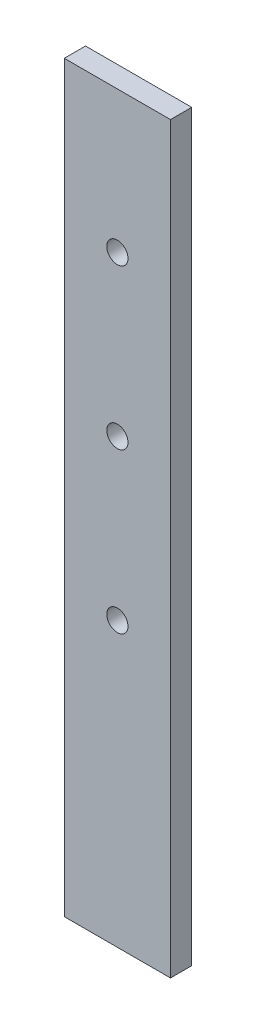
ISO-10303-21;
HEADER;
FILE_DESCRIPTION(('STEP AP214'),'2;1');
FILE_NAME('part.step','',(''),(''),'','','');
FILE_SCHEMA(('AUTOMOTIVE_DESIGN { 1 0 10303 214 1 1 1 1 }'));
ENDSEC;
DATA;
#1=APPLICATION_CONTEXT('core data for automotive mechanical design processes');
#2=APPLICATION_PROTOCOL_DEFINITION('international standard','automotive_design',2000,#1);
#3=PRODUCT_CONTEXT('',#1,'mechanical');
#4=PRODUCT('Part','Part','',(#3));
#5=PRODUCT_RELATED_PRODUCT_CATEGORY('part','',(#4));
#6=PRODUCT_DEFINITION_FORMATION('','',#4);
#7=PRODUCT_DEFINITION_CONTEXT('part definition',#1,'design');
#8=PRODUCT_DEFINITION('design','',#6,#7);
#9=PRODUCT_DEFINITION_SHAPE('','',#8);
#10=(LENGTH_UNIT() NAMED_UNIT(*) SI_UNIT(.MILLI.,.METRE.));
#11=(NAMED_UNIT(*) PLANE_ANGLE_UNIT() SI_UNIT($,.RADIAN.));
#12=(NAMED_UNIT(*) SI_UNIT($,.STERADIAN.) SOLID_ANGLE_UNIT());
#13=UNCERTAINTY_MEASURE_WITH_UNIT(LENGTH_MEASURE(1.E-05),#10,'distance_accuracy_value','');
#14=(GEOMETRIC_REPRESENTATION_CONTEXT(3) GLOBAL_UNCERTAINTY_ASSIGNED_CONTEXT((#13)) GLOBAL_UNIT_ASSIGNED_CONTEXT((#10,
#11,#12)) REPRESENTATION_CONTEXT('',''));
#15=CARTESIAN_POINT('',(0.,0.,0.));
#16=DIRECTION('',(0.,0.,1.));
#17=DIRECTION('',(1.,0.,0.));
#18=AXIS2_PLACEMENT_3D('',#15,#16,#17);
#19=CARTESIAN_POINT('',(0.,0.,6.));
#20=DIRECTION('',(1.,0.,0.));
#21=DIRECTION('',(0.,0.,-1.));
#22=AXIS2_PLACEMENT_3D('',#19,#20,#21);
#23=PLANE('',#22);
#24=DIRECTION('',(0.,-1.,0.));
#25=VECTOR('',#24,1.);
#26=CARTESIAN_POINT('',(0.,0.,0.));
#27=LINE('',#26,#25);
#28=CARTESIAN_POINT('',(0.,210.,0.));
#29=VERTEX_POINT('',#28);
#30=CARTESIAN_POINT('',(0.,0.,0.));
#31=VERTEX_POINT('',#30);
#32=EDGE_CURVE('E102',#29,#31,#27,.T.);
#33=ORIENTED_EDGE('',*,*,#32,.T.);
#34=DIRECTION('',(0.,0.,-1.));
#35=VECTOR('',#34,1.);
#36=CARTESIAN_POINT('',(0.,0.,6.));
#37=LINE('',#36,#35);
#38=CARTESIAN_POINT('',(0.,0.,6.));
#39=VERTEX_POINT('',#38);
#40=EDGE_CURVE('E11',#39,#31,#37,.T.);
#41=ORIENTED_EDGE('',*,*,#40,.F.);
#42=DIRECTION('',(0.,-1.,0.));
#43=VECTOR('',#42,1.);
#44=CARTESIAN_POINT('',(0.,0.,6.));
#45=LINE('',#44,#43);
#46=CARTESIAN_POINT('',(0.,210.,6.));
#47=VERTEX_POINT('',#46);
#48=EDGE_CURVE('E90',#47,#39,#45,.T.);
#49=ORIENTED_EDGE('',*,*,#48,.F.);
#50=DIRECTION('',(0.,0.,-1.));
#51=VECTOR('',#50,1.);
#52=CARTESIAN_POINT('',(0.,210.,6.));
#53=LINE('',#52,#51);
#54=EDGE_CURVE('E98',#47,#29,#53,.T.);
#55=ORIENTED_EDGE('',*,*,#54,.T.);
#56=EDGE_LOOP('',(#33,#41,#49,#55));
#57=FACE_BOUND('',#56,.T.);
#58=ADVANCED_FACE('F39',(#57),#23,.F.);
#59=CARTESIAN_POINT('',(0.,0.,6.));
#60=DIRECTION('',(0.,1.,0.));
#61=DIRECTION('',(0.,0.,1.));
#62=AXIS2_PLACEMENT_3D('',#59,#60,#61);
#63=PLANE('',#62);
#64=DIRECTION('',(1.,0.,0.));
#65=VECTOR('',#64,1.);
#66=CARTESIAN_POINT('',(0.,0.,0.));
#67=LINE('',#66,#65);
#68=CARTESIAN_POINT('',(30.,0.,0.));
#69=VERTEX_POINT('',#68);
#70=EDGE_CURVE('E94',#31,#69,#67,.T.);
#71=ORIENTED_EDGE('',*,*,#70,.T.);
#72=DIRECTION('',(0.,0.,-1.));
#73=VECTOR('',#72,1.);
#74=CARTESIAN_POINT('',(30.,0.,6.));
#75=LINE('',#74,#73);
#76=CARTESIAN_POINT('',(30.,0.,6.));
#77=VERTEX_POINT('',#76);
#78=EDGE_CURVE('E47',#77,#69,#75,.T.);
#79=ORIENTED_EDGE('',*,*,#78,.F.);
#80=DIRECTION('',(1.,0.,0.));
#81=VECTOR('',#80,1.);
#82=CARTESIAN_POINT('',(0.,0.,6.));
#83=LINE('',#82,#81);
#84=EDGE_CURVE('E85',#39,#77,#83,.T.);
#85=ORIENTED_EDGE('',*,*,#84,.F.);
#86=ORIENTED_EDGE('',*,*,#40,.T.);
#87=EDGE_LOOP('',(#71,#79,#85,#86));
#88=FACE_BOUND('',#87,.T.);
#89=ADVANCED_FACE('F93',(#88),#63,.F.);
#90=CARTESIAN_POINT('',(30.,210.,6.));
#91=DIRECTION('',(-1.,0.,0.));
#92=DIRECTION('',(0.,0.,1.));
#93=AXIS2_PLACEMENT_3D('',#90,#91,#92);
#94=PLANE('',#93);
#95=DIRECTION('',(0.,1.,0.));
#96=VECTOR('',#95,1.);
#97=CARTESIAN_POINT('',(30.,210.,0.));
#98=LINE('',#97,#96);
#99=CARTESIAN_POINT('',(30.,210.,0.));
#100=VERTEX_POINT('',#99);
#101=EDGE_CURVE('E72',#69,#100,#98,.T.);
#102=ORIENTED_EDGE('',*,*,#101,.T.);
#103=DIRECTION('',(0.,0.,-1.));
#104=VECTOR('',#103,1.);
#105=CARTESIAN_POINT('',(30.,210.,6.));
#106=LINE('',#105,#104);
#107=CARTESIAN_POINT('',(30.,210.,6.));
#108=VERTEX_POINT('',#107);
#109=EDGE_CURVE('E95',#108,#100,#106,.T.);
#110=ORIENTED_EDGE('',*,*,#109,.F.);
#111=DIRECTION('',(0.,1.,0.));
#112=VECTOR('',#111,1.);
#113=CARTESIAN_POINT('',(30.,210.,6.));
#114=LINE('',#113,#112);
#115=EDGE_CURVE('E88',#77,#108,#114,.T.);
#116=ORIENTED_EDGE('',*,*,#115,.F.);
#117=ORIENTED_EDGE('',*,*,#78,.T.);
#118=EDGE_LOOP('',(#102,#110,#116,#117));
#119=FACE_BOUND('',#118,.T.);
#120=ADVANCED_FACE('F96',(#119),#94,.F.);
#121=CARTESIAN_POINT('',(0.,210.,6.));
#122=DIRECTION('',(0.,-1.,0.));
#123=DIRECTION('',(1.,0.,0.));
#124=AXIS2_PLACEMENT_3D('',#121,#122,#123);
#125=PLANE('',#124);
#126=DIRECTION('',(-1.,0.,0.));
#127=VECTOR('',#126,1.);
#128=CARTESIAN_POINT('',(0.,210.,0.));
#129=LINE('',#128,#127);
#130=EDGE_CURVE('E78',#100,#29,#129,.T.);
#131=ORIENTED_EDGE('',*,*,#130,.T.);
#132=ORIENTED_EDGE('',*,*,#54,.F.);
#133=DIRECTION('',(-1.,0.,0.));
#134=VECTOR('',#133,1.);
#135=CARTESIAN_POINT('',(0.,210.,6.));
#136=LINE('',#135,#134);
#137=EDGE_CURVE('E55',#108,#47,#136,.T.);
#138=ORIENTED_EDGE('',*,*,#137,.F.);
#139=ORIENTED_EDGE('',*,*,#109,.T.);
#140=EDGE_LOOP('',(#131,#132,#138,#139));
#141=FACE_BOUND('',#140,.T.);
#142=ADVANCED_FACE('F110',(#141),#125,.F.);
#143=CARTESIAN_POINT('',(0.,0.,6.));
#144=DIRECTION('',(0.,0.,-1.));
#145=DIRECTION('',(-1.,0.,0.));
#146=AXIS2_PLACEMENT_3D('',#143,#144,#145);
#147=PLANE('',#146);
#148=CARTESIAN_POINT('',(15.,170.,6.));
#149=DIRECTION('',(0.,0.,1.));
#150=DIRECTION('',(1.,0.,0.));
#151=AXIS2_PLACEMENT_3D('',#148,#149,#150);
#152=CIRCLE('',#151,3.);
#153=CARTESIAN_POINT('',(18.,170.,6.));
#154=VERTEX_POINT('',#153);
#155=EDGE_CURVE('E128',#154,#154,#152,.T.);
#156=ORIENTED_EDGE('',*,*,#155,.F.);
#157=EDGE_LOOP('',(#156));
#158=FACE_BOUND('',#157,.T.);
#159=CARTESIAN_POINT('',(15.,125.,6.));
#160=DIRECTION('',(0.,0.,1.));
#161=DIRECTION('',(1.,0.,0.));
#162=AXIS2_PLACEMENT_3D('',#159,#160,#161);
#163=CIRCLE('',#162,3.);
#164=CARTESIAN_POINT('',(18.,125.,6.));
#165=VERTEX_POINT('',#164);
#166=EDGE_CURVE('E122',#165,#165,#163,.T.);
#167=ORIENTED_EDGE('',*,*,#166,.F.);
#168=EDGE_LOOP('',(#167));
#169=FACE_BOUND('',#168,.T.);
#170=CARTESIAN_POINT('',(15.,80.,6.));
#171=DIRECTION('',(0.,0.,1.));
#172=DIRECTION('',(1.,0.,0.));
#173=AXIS2_PLACEMENT_3D('',#170,#171,#172);
#174=CIRCLE('',#173,3.);
#175=CARTESIAN_POINT('',(18.,80.,6.));
#176=VERTEX_POINT('',#175);
#177=EDGE_CURVE('E116',#176,#176,#174,.T.);
#178=ORIENTED_EDGE('',*,*,#177,.F.);
#179=EDGE_LOOP('',(#178));
#180=FACE_BOUND('',#179,.T.);
#181=ORIENTED_EDGE('',*,*,#48,.T.);
#182=ORIENTED_EDGE('',*,*,#84,.T.);
#183=ORIENTED_EDGE('',*,*,#115,.T.);
#184=ORIENTED_EDGE('',*,*,#137,.T.);
#185=EDGE_LOOP('',(#181,#182,#183,#184));
#186=FACE_BOUND('',#185,.T.);
#187=ADVANCED_FACE('F86',(#158,#169,#180,#186),#147,.F.);
#188=CARTESIAN_POINT('',(0.,0.,0.));
#189=DIRECTION('',(0.,0.,-1.));
#190=DIRECTION('',(-1.,0.,0.));
#191=AXIS2_PLACEMENT_3D('',#188,#189,#190);
#192=PLANE('',#191);
#193=CARTESIAN_POINT('',(15.,170.,0.));
#194=DIRECTION('',(0.,0.,1.));
#195=DIRECTION('',(1.,0.,0.));
#196=AXIS2_PLACEMENT_3D('',#193,#194,#195);
#197=CIRCLE('',#196,3.);
#198=CARTESIAN_POINT('',(18.,170.,0.));
#199=VERTEX_POINT('',#198);
#200=EDGE_CURVE('E105',#199,#199,#197,.T.);
#201=ORIENTED_EDGE('',*,*,#200,.T.);
#202=EDGE_LOOP('',(#201));
#203=FACE_BOUND('',#202,.T.);
#204=CARTESIAN_POINT('',(15.,125.,0.));
#205=DIRECTION('',(0.,0.,1.));
#206=DIRECTION('',(1.,0.,0.));
#207=AXIS2_PLACEMENT_3D('',#204,#205,#206);
#208=CIRCLE('',#207,3.);
#209=CARTESIAN_POINT('',(18.,125.,0.));
#210=VERTEX_POINT('',#209);
#211=EDGE_CURVE('E125',#210,#210,#208,.T.);
#212=ORIENTED_EDGE('',*,*,#211,.T.);
#213=EDGE_LOOP('',(#212));
#214=FACE_BOUND('',#213,.T.);
#215=CARTESIAN_POINT('',(15.,80.,0.));
#216=DIRECTION('',(0.,0.,1.));
#217=DIRECTION('',(1.,0.,0.));
#218=AXIS2_PLACEMENT_3D('',#215,#216,#217);
#219=CIRCLE('',#218,3.);
#220=CARTESIAN_POINT('',(18.,80.,0.));
#221=VERTEX_POINT('',#220);
#222=EDGE_CURVE('E119',#221,#221,#219,.T.);
#223=ORIENTED_EDGE('',*,*,#222,.T.);
#224=EDGE_LOOP('',(#223));
#225=FACE_BOUND('',#224,.T.);
#226=ORIENTED_EDGE('',*,*,#32,.F.);
#227=ORIENTED_EDGE('',*,*,#130,.F.);
#228=ORIENTED_EDGE('',*,*,#101,.F.);
#229=ORIENTED_EDGE('',*,*,#70,.F.);
#230=EDGE_LOOP('',(#226,#227,#228,#229));
#231=FACE_BOUND('',#230,.T.);
#232=ADVANCED_FACE('F113',(#203,#214,#225,#231),#192,.T.);
#233=CARTESIAN_POINT('',(15.,80.,0.));
#234=DIRECTION('',(0.,0.,1.));
#235=DIRECTION('',(1.,0.,0.));
#236=AXIS2_PLACEMENT_3D('',#233,#234,#235);
#237=CYLINDRICAL_SURFACE('',#236,3.);
#238=ORIENTED_EDGE('',*,*,#222,.F.);
#239=EDGE_LOOP('',(#238));
#240=FACE_BOUND('',#239,.T.);
#241=ORIENTED_EDGE('',*,*,#177,.T.);
#242=EDGE_LOOP('',(#241));
#243=FACE_BOUND('',#242,.T.);
#244=ADVANCED_FACE('F150',(#240,#243),#237,.F.);
#245=CARTESIAN_POINT('',(15.,125.,0.));
#246=DIRECTION('',(0.,0.,1.));
#247=DIRECTION('',(1.,0.,0.));
#248=AXIS2_PLACEMENT_3D('',#245,#246,#247);
#249=CYLINDRICAL_SURFACE('',#248,3.);
#250=ORIENTED_EDGE('',*,*,#211,.F.);
#251=EDGE_LOOP('',(#250));
#252=FACE_BOUND('',#251,.T.);
#253=ORIENTED_EDGE('',*,*,#166,.T.);
#254=EDGE_LOOP('',(#253));
#255=FACE_BOUND('',#254,.T.);
#256=ADVANCED_FACE('F139',(#252,#255),#249,.F.);
#257=CARTESIAN_POINT('',(15.,170.,0.));
#258=DIRECTION('',(0.,0.,1.));
#259=DIRECTION('',(1.,0.,0.));
#260=AXIS2_PLACEMENT_3D('',#257,#258,#259);
#261=CYLINDRICAL_SURFACE('',#260,3.);
#262=ORIENTED_EDGE('',*,*,#200,.F.);
#263=EDGE_LOOP('',(#262));
#264=FACE_BOUND('',#263,.T.);
#265=ORIENTED_EDGE('',*,*,#155,.T.);
#266=EDGE_LOOP('',(#265));
#267=FACE_BOUND('',#266,.T.);
#268=ADVANCED_FACE('F136',(#264,#267),#261,.F.);
#269=CLOSED_SHELL('',(#58,#89,#120,#142,#187,#232,#244,#256,#268));
#270=MANIFOLD_SOLID_BREP('B2',#269);
#271=ADVANCED_BREP_SHAPE_REPRESENTATION('',(#18,#270),#14);
#272=SHAPE_DEFINITION_REPRESENTATION(#9,#271);
ENDSEC;
END-ISO-10303-21;
